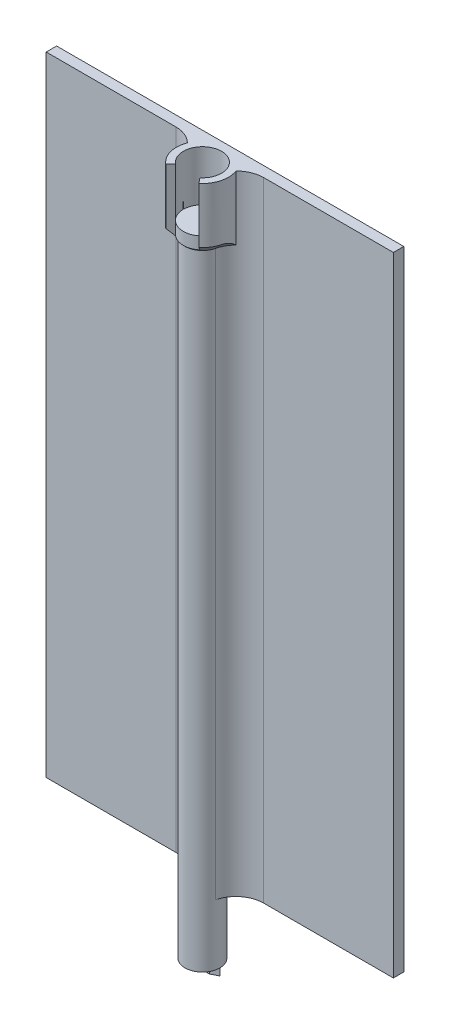
ISO-10303-21;
HEADER;
FILE_DESCRIPTION(('STEP AP214'),'2;1');
FILE_NAME('part.step','',(''),(''),'','','');
FILE_SCHEMA(('AUTOMOTIVE_DESIGN { 1 0 10303 214 1 1 1 1 }'));
ENDSEC;
DATA;
#1=APPLICATION_CONTEXT('core data for automotive mechanical design processes');
#2=APPLICATION_PROTOCOL_DEFINITION('international standard','automotive_design',2000,#1);
#3=PRODUCT_CONTEXT('',#1,'mechanical');
#4=PRODUCT('Part','Part','',(#3));
#5=PRODUCT_RELATED_PRODUCT_CATEGORY('part','',(#4));
#6=PRODUCT_DEFINITION_FORMATION('','',#4);
#7=PRODUCT_DEFINITION_CONTEXT('part definition',#1,'design');
#8=PRODUCT_DEFINITION('design','',#6,#7);
#9=PRODUCT_DEFINITION_SHAPE('','',#8);
#10=(LENGTH_UNIT() NAMED_UNIT(*) SI_UNIT(.MILLI.,.METRE.));
#11=(NAMED_UNIT(*) PLANE_ANGLE_UNIT() SI_UNIT($,.RADIAN.));
#12=(NAMED_UNIT(*) SI_UNIT($,.STERADIAN.) SOLID_ANGLE_UNIT());
#13=UNCERTAINTY_MEASURE_WITH_UNIT(LENGTH_MEASURE(1.E-05),#10,'distance_accuracy_value','');
#14=(GEOMETRIC_REPRESENTATION_CONTEXT(3) GLOBAL_UNCERTAINTY_ASSIGNED_CONTEXT((#13)) GLOBAL_UNIT_ASSIGNED_CONTEXT((#10,
#11,#12)) REPRESENTATION_CONTEXT('',''));
#15=CARTESIAN_POINT('',(0.,0.,0.));
#16=DIRECTION('',(0.,0.,1.));
#17=DIRECTION('',(1.,0.,0.));
#18=AXIS2_PLACEMENT_3D('',#15,#16,#17);
#19=CARTESIAN_POINT('',(0.,0.,3.));
#20=DIRECTION('',(0.,0.,-1.));
#21=DIRECTION('',(-1.,0.,0.));
#22=AXIS2_PLACEMENT_3D('',#19,#20,#21);
#23=PLANE('',#22);
#24=DIRECTION('',(-1.,0.,0.));
#25=VECTOR('',#24,1.);
#26=CARTESIAN_POINT('',(100.,5.,3.));
#27=LINE('',#26,#25);
#28=CARTESIAN_POINT('',(100.,5.,3.));
#29=VERTEX_POINT('',#28);
#30=CARTESIAN_POINT('',(62.6491106406735,5.,3.));
#31=VERTEX_POINT('',#30);
#32=EDGE_CURVE('E357',#29,#31,#27,.T.);
#33=ORIENTED_EDGE('',*,*,#32,.F.);
#34=DIRECTION('',(0.,1.,0.));
#35=VECTOR('',#34,1.);
#36=CARTESIAN_POINT('',(100.,0.,3.));
#37=LINE('',#36,#35);
#38=CARTESIAN_POINT('',(100.,186.,3.));
#39=VERTEX_POINT('',#38);
#40=EDGE_CURVE('E363',#29,#39,#37,.T.);
#41=ORIENTED_EDGE('',*,*,#40,.T.);
#42=DIRECTION('',(1.,0.,0.));
#43=VECTOR('',#42,1.);
#44=CARTESIAN_POINT('',(62.6491106406735,186.,3.));
#45=LINE('',#44,#43);
#46=CARTESIAN_POINT('',(62.6491106406735,186.,3.));
#47=VERTEX_POINT('',#46);
#48=EDGE_CURVE('E362',#47,#39,#45,.T.);
#49=ORIENTED_EDGE('',*,*,#48,.F.);
#50=DIRECTION('',(0.,1.,0.));
#51=VECTOR('',#50,1.);
#52=CARTESIAN_POINT('',(62.6491106406735,0.,3.));
#53=LINE('',#52,#51);
#54=EDGE_CURVE('E260',#47,#31,#53,.F.);
#55=ORIENTED_EDGE('',*,*,#54,.T.);
#56=EDGE_LOOP('',(#33,#41,#49,#55));
#57=FACE_BOUND('',#56,.T.);
#58=ADVANCED_FACE('F46',(#57),#23,.F.);
#59=CARTESIAN_POINT('',(0.,0.,3.));
#60=DIRECTION('',(1.,0.,0.));
#61=DIRECTION('',(0.,0.,-1.));
#62=AXIS2_PLACEMENT_3D('',#59,#60,#61);
#63=PLANE('',#62);
#64=DIRECTION('',(0.,0.,-1.));
#65=VECTOR('',#64,1.);
#66=CARTESIAN_POINT('',(0.,5.,3.));
#67=LINE('',#66,#65);
#68=CARTESIAN_POINT('',(0.,5.,3.));
#69=VERTEX_POINT('',#68);
#70=CARTESIAN_POINT('',(0.,5.,0.));
#71=VERTEX_POINT('',#70);
#72=EDGE_CURVE('E251',#69,#71,#67,.T.);
#73=ORIENTED_EDGE('',*,*,#72,.F.);
#74=DIRECTION('',(0.,-1.,0.));
#75=VECTOR('',#74,1.);
#76=CARTESIAN_POINT('',(0.,0.,3.));
#77=LINE('',#76,#75);
#78=CARTESIAN_POINT('',(0.,186.,3.));
#79=VERTEX_POINT('',#78);
#80=EDGE_CURVE('E249',#79,#69,#77,.T.);
#81=ORIENTED_EDGE('',*,*,#80,.F.);
#82=DIRECTION('',(0.,0.,1.));
#83=VECTOR('',#82,1.);
#84=CARTESIAN_POINT('',(0.,186.,0.));
#85=LINE('',#84,#83);
#86=CARTESIAN_POINT('',(0.,186.,0.));
#87=VERTEX_POINT('',#86);
#88=EDGE_CURVE('E382',#87,#79,#85,.T.);
#89=ORIENTED_EDGE('',*,*,#88,.F.);
#90=DIRECTION('',(0.,-1.,0.));
#91=VECTOR('',#90,1.);
#92=CARTESIAN_POINT('',(0.,0.,0.));
#93=LINE('',#92,#91);
#94=EDGE_CURVE('E471',#87,#71,#93,.T.);
#95=ORIENTED_EDGE('',*,*,#94,.T.);
#96=EDGE_LOOP('',(#73,#81,#89,#95));
#97=FACE_BOUND('',#96,.T.);
#98=ADVANCED_FACE('F319',(#97),#63,.F.);
#99=CARTESIAN_POINT('',(100.,0.,3.));
#100=DIRECTION('',(-1.,0.,0.));
#101=DIRECTION('',(0.,0.,1.));
#102=AXIS2_PLACEMENT_3D('',#99,#100,#101);
#103=PLANE('',#102);
#104=DIRECTION('',(0.,0.,1.));
#105=VECTOR('',#104,1.);
#106=CARTESIAN_POINT('',(100.,5.,0.));
#107=LINE('',#106,#105);
#108=CARTESIAN_POINT('',(100.,5.,0.));
#109=VERTEX_POINT('',#108);
#110=EDGE_CURVE('E645',#109,#29,#107,.T.);
#111=ORIENTED_EDGE('',*,*,#110,.F.);
#112=DIRECTION('',(0.,1.,0.));
#113=VECTOR('',#112,1.);
#114=CARTESIAN_POINT('',(100.,0.,0.));
#115=LINE('',#114,#113);
#116=CARTESIAN_POINT('',(100.,186.,0.));
#117=VERTEX_POINT('',#116);
#118=EDGE_CURVE('E474',#109,#117,#115,.T.);
#119=ORIENTED_EDGE('',*,*,#118,.T.);
#120=DIRECTION('',(0.,0.,-1.));
#121=VECTOR('',#120,1.);
#122=CARTESIAN_POINT('',(100.,186.,3.));
#123=LINE('',#122,#121);
#124=EDGE_CURVE('E368',#39,#117,#123,.T.);
#125=ORIENTED_EDGE('',*,*,#124,.F.);
#126=ORIENTED_EDGE('',*,*,#40,.F.);
#127=EDGE_LOOP('',(#111,#119,#125,#126));
#128=FACE_BOUND('',#127,.T.);
#129=ADVANCED_FACE('F326',(#128),#103,.F.);
#130=DIRECTION('',(-1.,0.,0.));
#131=VECTOR('',#130,1.);
#132=CARTESIAN_POINT('',(37.3508893593265,5.,3.));
#133=LINE('',#132,#131);
#134=CARTESIAN_POINT('',(37.3508893593265,5.,3.));
#135=VERTEX_POINT('',#134);
#136=EDGE_CURVE('E235',#135,#69,#133,.T.);
#137=ORIENTED_EDGE('',*,*,#136,.F.);
#138=DIRECTION('',(0.,1.,0.));
#139=VECTOR('',#138,1.);
#140=CARTESIAN_POINT('',(37.3508893593265,0.,3.));
#141=LINE('',#140,#139);
#142=CARTESIAN_POINT('',(37.3508893593265,186.,3.));
#143=VERTEX_POINT('',#142);
#144=EDGE_CURVE('E247',#135,#143,#141,.T.);
#145=ORIENTED_EDGE('',*,*,#144,.T.);
#146=DIRECTION('',(1.,0.,0.));
#147=VECTOR('',#146,1.);
#148=CARTESIAN_POINT('',(0.,186.,3.));
#149=LINE('',#148,#147);
#150=EDGE_CURVE('E386',#79,#143,#149,.T.);
#151=ORIENTED_EDGE('',*,*,#150,.F.);
#152=ORIENTED_EDGE('',*,*,#80,.T.);
#153=EDGE_LOOP('',(#137,#145,#151,#152));
#154=FACE_BOUND('',#153,.T.);
#155=ADVANCED_FACE('F245',(#154),#23,.F.);
#156=CARTESIAN_POINT('',(0.,0.,0.));
#157=DIRECTION('',(0.,0.,-1.));
#158=DIRECTION('',(-1.,0.,0.));
#159=AXIS2_PLACEMENT_3D('',#156,#157,#158);
#160=PLANE('',#159);
#161=ORIENTED_EDGE('',*,*,#118,.F.);
#162=DIRECTION('',(1.,0.,0.));
#163=VECTOR('',#162,1.);
#164=CARTESIAN_POINT('',(0.,5.,0.));
#165=LINE('',#164,#163);
#166=EDGE_CURVE('E648',#71,#109,#165,.T.);
#167=ORIENTED_EDGE('',*,*,#166,.F.);
#168=ORIENTED_EDGE('',*,*,#94,.F.);
#169=DIRECTION('',(-1.,0.,0.));
#170=VECTOR('',#169,1.);
#171=CARTESIAN_POINT('',(100.,186.,0.));
#172=LINE('',#171,#170);
#173=EDGE_CURVE('E373',#117,#87,#172,.T.);
#174=ORIENTED_EDGE('',*,*,#173,.F.);
#175=EDGE_LOOP('',(#161,#167,#168,#174));
#176=FACE_BOUND('',#175,.T.);
#177=ADVANCED_FACE('F333',(#176),#160,.T.);
#178=CARTESIAN_POINT('',(62.6491106406735,-14.142135623731,11.));
#179=DIRECTION('',(0.,1.,0.));
#180=DIRECTION('',(0.,0.,1.));
#181=AXIS2_PLACEMENT_3D('',#178,#179,#180);
#182=CYLINDRICAL_SURFACE('',#181,8.);
#183=CARTESIAN_POINT('',(62.6491106406735,5.,11.));
#184=DIRECTION('',(0.,1.,0.));
#185=DIRECTION('',(0.,0.,-1.));
#186=AXIS2_PLACEMENT_3D('',#183,#184,#185);
#187=CIRCLE('',#186,8.);
#188=CARTESIAN_POINT('',(54.8650425541052,5.,9.15384615384615));
#189=VERTEX_POINT('',#188);
#190=EDGE_CURVE('E353',#31,#189,#187,.T.);
#191=ORIENTED_EDGE('',*,*,#190,.F.);
#192=ORIENTED_EDGE('',*,*,#54,.F.);
#193=CARTESIAN_POINT('',(62.6491106406735,186.,11.));
#194=DIRECTION('',(0.,-1.,0.));
#195=DIRECTION('',(0.,0.,1.));
#196=AXIS2_PLACEMENT_3D('',#193,#194,#195);
#197=CIRCLE('',#196,8.);
#198=CARTESIAN_POINT('',(57.0077615383015,186.,5.32768298618929));
#199=VERTEX_POINT('',#198);
#200=EDGE_CURVE('E369',#199,#47,#197,.T.);
#201=ORIENTED_EDGE('',*,*,#200,.F.);
#202=DIRECTION('',(0.,-1.,0.));
#203=VECTOR('',#202,1.);
#204=CARTESIAN_POINT('',(57.0077615383015,186.,5.32768298618929));
#205=LINE('',#204,#203);
#206=CARTESIAN_POINT('',(57.0077615383015,167.5,5.32768298618929));
#207=VERTEX_POINT('',#206);
#208=EDGE_CURVE('E389',#199,#207,#205,.T.);
#209=ORIENTED_EDGE('',*,*,#208,.T.);
#210=CARTESIAN_POINT('',(62.6491106406735,167.5,11.));
#211=DIRECTION('',(0.,1.,0.));
#212=DIRECTION('',(0.,0.,1.));
#213=AXIS2_PLACEMENT_3D('',#210,#211,#212);
#214=CIRCLE('',#213,8.);
#215=CARTESIAN_POINT('',(54.8650425541052,167.5,9.15384615384615));
#216=VERTEX_POINT('',#215);
#217=EDGE_CURVE('E265',#207,#216,#214,.T.);
#218=ORIENTED_EDGE('',*,*,#217,.T.);
#219=DIRECTION('',(0.,1.,0.));
#220=VECTOR('',#219,1.);
#221=CARTESIAN_POINT('',(54.8650425541052,-14.142135623731,9.15384615384615));
#222=LINE('',#221,#220);
#223=EDGE_CURVE('E268',#189,#216,#222,.T.);
#224=ORIENTED_EDGE('',*,*,#223,.F.);
#225=EDGE_LOOP('',(#191,#192,#201,#209,#218,#224));
#226=FACE_BOUND('',#225,.T.);
#227=ADVANCED_FACE('F338',(#226),#182,.F.);
#228=CARTESIAN_POINT('',(37.3508893593265,-14.142135623731,11.));
#229=DIRECTION('',(0.,1.,0.));
#230=DIRECTION('',(0.,0.,1.));
#231=AXIS2_PLACEMENT_3D('',#228,#229,#230);
#232=CYLINDRICAL_SURFACE('',#231,8.);
#233=CARTESIAN_POINT('',(37.3508893593265,5.,11.));
#234=DIRECTION('',(0.,1.,0.));
#235=DIRECTION('',(0.,0.,-1.));
#236=AXIS2_PLACEMENT_3D('',#233,#234,#235);
#237=CIRCLE('',#236,8.);
#238=CARTESIAN_POINT('',(45.1349574458948,5.,9.15384615384616));
#239=VERTEX_POINT('',#238);
#240=EDGE_CURVE('E232',#239,#135,#237,.T.);
#241=ORIENTED_EDGE('',*,*,#240,.F.);
#242=DIRECTION('',(0.,1.,0.));
#243=VECTOR('',#242,1.);
#244=CARTESIAN_POINT('',(45.1349574458948,-14.142135623731,9.15384615384616));
#245=LINE('',#244,#243);
#246=CARTESIAN_POINT('',(45.1349574458948,167.5,9.15384615384616));
#247=VERTEX_POINT('',#246);
#248=EDGE_CURVE('E477',#247,#239,#245,.F.);
#249=ORIENTED_EDGE('',*,*,#248,.F.);
#250=CARTESIAN_POINT('',(37.3508893593265,167.5,11.));
#251=DIRECTION('',(0.,1.,0.));
#252=DIRECTION('',(0.,0.,1.));
#253=AXIS2_PLACEMENT_3D('',#250,#251,#252);
#254=CIRCLE('',#253,8.);
#255=CARTESIAN_POINT('',(42.9922384616985,167.5,5.32768298618929));
#256=VERTEX_POINT('',#255);
#257=EDGE_CURVE('E259',#247,#256,#254,.T.);
#258=ORIENTED_EDGE('',*,*,#257,.T.);
#259=DIRECTION('',(0.,-1.,0.));
#260=VECTOR('',#259,1.);
#261=CARTESIAN_POINT('',(42.9922384616985,186.,5.32768298618929));
#262=LINE('',#261,#260);
#263=CARTESIAN_POINT('',(42.9922384616985,186.,5.32768298618929));
#264=VERTEX_POINT('',#263);
#265=EDGE_CURVE('E396',#264,#256,#262,.T.);
#266=ORIENTED_EDGE('',*,*,#265,.F.);
#267=CARTESIAN_POINT('',(37.3508893593265,186.,11.));
#268=DIRECTION('',(0.,-1.,0.));
#269=DIRECTION('',(0.,0.,1.));
#270=AXIS2_PLACEMENT_3D('',#267,#268,#269);
#271=CIRCLE('',#270,8.);
#272=EDGE_CURVE('E257',#143,#264,#271,.T.);
#273=ORIENTED_EDGE('',*,*,#272,.F.);
#274=ORIENTED_EDGE('',*,*,#144,.F.);
#275=EDGE_LOOP('',(#241,#249,#258,#266,#273,#274));
#276=FACE_BOUND('',#275,.T.);
#277=ADVANCED_FACE('F254',(#276),#232,.F.);
#278=CARTESIAN_POINT('',(50.,-14.501,8.));
#279=DIRECTION('',(0.,1.,0.));
#280=DIRECTION('',(0.,0.,1.));
#281=AXIS2_PLACEMENT_3D('',#278,#279,#280);
#282=CYLINDRICAL_SURFACE('',#281,5.5);
#283=CARTESIAN_POINT('',(50.,171.5,8.));
#284=DIRECTION('',(0.,1.,0.));
#285=DIRECTION('',(0.,0.,1.));
#286=AXIS2_PLACEMENT_3D('',#283,#284,#285);
#287=CIRCLE('',#286,5.5);
#288=CARTESIAN_POINT('',(46.5,171.5,12.2426406871193));
#289=VERTEX_POINT('',#288);
#290=CARTESIAN_POINT('',(53.5,171.5,12.2426406871193));
#291=VERTEX_POINT('',#290);
#292=EDGE_CURVE('E633',#289,#291,#287,.T.);
#293=ORIENTED_EDGE('',*,*,#292,.F.);
#294=DIRECTION('',(0.,1.,0.));
#295=VECTOR('',#294,1.);
#296=CARTESIAN_POINT('',(46.5,-14.501,12.2426406871193));
#297=LINE('',#296,#295);
#298=CARTESIAN_POINT('',(46.5,168.,12.2426406871193));
#299=VERTEX_POINT('',#298);
#300=EDGE_CURVE('E570',#299,#289,#297,.T.);
#301=ORIENTED_EDGE('',*,*,#300,.F.);
#302=CARTESIAN_POINT('',(50.,168.,8.));
#303=DIRECTION('',(0.,1.,0.));
#304=DIRECTION('',(0.,0.,1.));
#305=AXIS2_PLACEMENT_3D('',#302,#303,#304);
#306=CIRCLE('',#305,5.5);
#307=CARTESIAN_POINT('',(53.5,168.,12.2426406871193));
#308=VERTEX_POINT('',#307);
#309=EDGE_CURVE('E58',#299,#308,#306,.T.);
#310=ORIENTED_EDGE('',*,*,#309,.T.);
#311=DIRECTION('',(0.,1.,0.));
#312=VECTOR('',#311,1.);
#313=CARTESIAN_POINT('',(53.5,-14.501,12.2426406871193));
#314=LINE('',#313,#312);
#315=EDGE_CURVE('E574',#308,#291,#314,.T.);
#316=ORIENTED_EDGE('',*,*,#315,.T.);
#317=EDGE_LOOP('',(#293,#301,#310,#316));
#318=FACE_BOUND('',#317,.T.);
#319=ADVANCED_FACE('F350',(#318),#282,.T.);
#320=CARTESIAN_POINT('',(50.,186.,8.));
#321=DIRECTION('',(0.,-1.,0.));
#322=DIRECTION('',(0.,0.,-1.));
#323=AXIS2_PLACEMENT_3D('',#320,#321,#322);
#324=CYLINDRICAL_SURFACE('',#323,7.5);
#325=ORIENTED_EDGE('',*,*,#265,.T.);
#326=CARTESIAN_POINT('',(42.9922384616985,167.5,5.32768298618928));
#327=CARTESIAN_POINT('',(42.9617722844058,167.578131879212,5.40758353514014));
#328=CARTESIAN_POINT('',(42.9325252242345,167.655820019289,5.4883758120596));
#329=CARTESIAN_POINT('',(42.876541438332,167.810134983572,5.65184939678492));
#330=CARTESIAN_POINT('',(42.8498051513553,167.886761620294,5.73453103162658));
#331=CARTESIAN_POINT('',(42.7732755527246,168.115376278993,5.98621812586946));
#332=CARTESIAN_POINT('',(42.7274149000267,168.265449562082,6.15820638188107));
#333=CARTESIAN_POINT('',(42.6454737688333,168.56395151696,6.51799036748483));
#334=CARTESIAN_POINT('',(42.6098532272861,168.712078991326,6.70614248560052));
#335=CARTESIAN_POINT('',(42.5524527679631,168.996073760214,7.09321290457301));
#336=CARTESIAN_POINT('',(42.5306462889955,169.131964149318,7.29210974138871));
#337=CARTESIAN_POINT('',(42.5105973632104,169.3160741218,7.59064334358421));
#338=CARTESIAN_POINT('',(42.5059895831001,169.371712984647,7.68530249605931));
#339=CARTESIAN_POINT('',(42.5003861555197,169.478243627192,7.87739724677104));
#340=CARTESIAN_POINT('',(42.4993907744316,169.52913505654,7.97483304922674));
#341=CARTESIAN_POINT('',(42.5013201657649,169.624482344453,8.17121296754097));
#342=CARTESIAN_POINT('',(42.5041937890188,169.669013730931,8.27012063901423));
#343=CARTESIAN_POINT('',(42.5141044408867,169.751220094265,8.47056288045698));
#344=CARTESIAN_POINT('',(42.5211407875799,169.788896192806,8.57209701756469));
#345=CARTESIAN_POINT('',(42.5381155359772,169.850365614392,8.7600012849123));
#346=CARTESIAN_POINT('',(42.5473578163175,169.875430052344,8.84601707364397));
#347=CARTESIAN_POINT('',(42.5690664818109,169.91917111767,9.01923742082545));
#348=CARTESIAN_POINT('',(42.5815315065788,169.937850432626,9.10644146301178));
#349=CARTESIAN_POINT('',(42.6100284827085,169.968429637059,9.28314139527606));
#350=CARTESIAN_POINT('',(42.6261209878257,169.980200517391,9.3726501777183));
#351=CARTESIAN_POINT('',(42.6617244192038,169.996020162218,9.55181686409721));
#352=CARTESIAN_POINT('',(42.6812408575192,170.00005634808,9.64147477401341));
#353=CARTESIAN_POINT('',(42.7024361688422,170.,9.73076923076925));
#354=B_SPLINE_CURVE_WITH_KNOTS('',3,(#326,#327,#328,#329,#330,#331,#332,#333,#334,#335,#336,
#337,#338,#339,#340,#341,#342,#343,#344,#345,#346,#347,#348,#349,#350,#351,#352,#353),
.UNSPECIFIED.,.F.,.F.,(4,2,2,2,2,2,2,2,2,2,2,2,2,4),(0.,0.347470583809525,0.695001775105091,
1.39293859532156,2.11855144427092,2.84276484157499,3.17230030645231,3.50186007111648,
3.82710548252779,4.15229762827214,4.42224264120378,4.69207389043962,4.96679567223757,
5.24196384546593),.UNSPECIFIED.);
#355=CARTESIAN_POINT('',(42.7024361688422,170.,9.73076923076923));
#356=VERTEX_POINT('',#355);
#357=EDGE_CURVE('E278',#256,#356,#354,.T.);
#358=ORIENTED_EDGE('',*,*,#357,.T.);
#359=CARTESIAN_POINT('',(50.,170.,8.));
#360=DIRECTION('',(0.,1.,0.));
#361=DIRECTION('',(0.,0.,1.));
#362=AXIS2_PLACEMENT_3D('',#359,#360,#361);
#363=CIRCLE('',#362,7.5);
#364=CARTESIAN_POINT('',(45.2272727272727,170.,13.785419118799));
#365=VERTEX_POINT('',#364);
#366=EDGE_CURVE('E390',#356,#365,#363,.T.);
#367=ORIENTED_EDGE('',*,*,#366,.T.);
#368=DIRECTION('',(0.,1.,0.));
#369=VECTOR('',#368,1.);
#370=CARTESIAN_POINT('',(45.2272727272727,-14.501,13.785419118799));
#371=LINE('',#370,#369);
#372=CARTESIAN_POINT('',(45.2272727272727,186.,13.785419118799));
#373=VERTEX_POINT('',#372);
#374=EDGE_CURVE('E565',#365,#373,#371,.T.);
#375=ORIENTED_EDGE('',*,*,#374,.T.);
#376=CARTESIAN_POINT('',(50.,186.,8.));
#377=DIRECTION('',(0.,1.,0.));
#378=DIRECTION('',(0.,0.,1.));
#379=AXIS2_PLACEMENT_3D('',#376,#377,#378);
#380=CIRCLE('',#379,7.5);
#381=EDGE_CURVE('E375',#264,#373,#380,.T.);
#382=ORIENTED_EDGE('',*,*,#381,.F.);
#383=EDGE_LOOP('',(#325,#358,#367,#375,#382));
#384=FACE_BOUND('',#383,.T.);
#385=ADVANCED_FACE('F657',(#384),#324,.T.);
#386=CARTESIAN_POINT('',(50.,-12.5,8.));
#387=DIRECTION('',(0.,-1.,0.));
#388=DIRECTION('',(0.,0.,-1.));
#389=AXIS2_PLACEMENT_3D('',#386,#387,#388);
#390=PLANE('',#389);
#391=DIRECTION('',(-0.894427190999917,0.,0.447213595499956));
#392=VECTOR('',#391,1.);
#393=CARTESIAN_POINT('',(53.,-12.5,9.));
#394=LINE('',#393,#392);
#395=CARTESIAN_POINT('',(55.,-12.5,8.));
#396=VERTEX_POINT('',#395);
#397=CARTESIAN_POINT('',(53.,-12.5,9.));
#398=VERTEX_POINT('',#397);
#399=EDGE_CURVE('E399',#396,#398,#394,.T.);
#400=ORIENTED_EDGE('',*,*,#399,.F.);
#401=CARTESIAN_POINT('',(50.,-12.5,8.));
#402=DIRECTION('',(0.,-1.,0.));
#403=DIRECTION('',(0.,0.,-1.));
#404=AXIS2_PLACEMENT_3D('',#401,#402,#403);
#405=CIRCLE('',#404,5.);
#406=CARTESIAN_POINT('',(45.,-12.5,8.));
#407=VERTEX_POINT('',#406);
#408=EDGE_CURVE('E467',#396,#407,#405,.T.);
#409=ORIENTED_EDGE('',*,*,#408,.T.);
#410=DIRECTION('',(-0.894427190999916,0.,-0.447213595499957));
#411=VECTOR('',#410,1.);
#412=CARTESIAN_POINT('',(47.,-12.5,9.));
#413=LINE('',#412,#411);
#414=CARTESIAN_POINT('',(47.,-12.5,9.));
#415=VERTEX_POINT('',#414);
#416=EDGE_CURVE('E428',#415,#407,#413,.T.);
#417=ORIENTED_EDGE('',*,*,#416,.F.);
#418=DIRECTION('',(-1.,0.,0.));
#419=VECTOR('',#418,1.);
#420=CARTESIAN_POINT('',(47.,-12.5,9.));
#421=LINE('',#420,#419);
#422=EDGE_CURVE('E424',#398,#415,#421,.T.);
#423=ORIENTED_EDGE('',*,*,#422,.F.);
#424=EDGE_LOOP('',(#400,#409,#417,#423));
#425=FACE_BOUND('',#424,.T.);
#426=ADVANCED_FACE('F700',(#425),#390,.T.);
#427=CARTESIAN_POINT('',(50.,-14.142135623731,8.));
#428=DIRECTION('',(0.,1.,0.));
#429=DIRECTION('',(0.,0.,1.));
#430=AXIS2_PLACEMENT_3D('',#427,#428,#429);
#431=CYLINDRICAL_SURFACE('',#430,5.);
#432=CARTESIAN_POINT('',(50.,5.,8.));
#433=DIRECTION('',(0.,1.,0.));
#434=DIRECTION('',(0.,0.,-1.));
#435=AXIS2_PLACEMENT_3D('',#432,#433,#434);
#436=CIRCLE('',#435,5.);
#437=EDGE_CURVE('E66',#189,#239,#436,.T.);
#438=ORIENTED_EDGE('',*,*,#437,.F.);
#439=ORIENTED_EDGE('',*,*,#223,.T.);
#440=CARTESIAN_POINT('',(50.,167.5,8.));
#441=DIRECTION('',(0.,1.,0.));
#442=DIRECTION('',(0.,0.,1.));
#443=AXIS2_PLACEMENT_3D('',#440,#441,#442);
#444=CIRCLE('',#443,5.);
#445=EDGE_CURVE('E275',#216,#247,#444,.F.);
#446=ORIENTED_EDGE('',*,*,#445,.T.);
#447=ORIENTED_EDGE('',*,*,#248,.T.);
#448=EDGE_LOOP('',(#438,#439,#446,#447));
#449=FACE_BOUND('',#448,.T.);
#450=ORIENTED_EDGE('',*,*,#408,.F.);
#451=EDGE_CURVE('E466',#407,#396,#405,.T.);
#452=ORIENTED_EDGE('',*,*,#451,.F.);
#453=EDGE_LOOP('',(#450,#452));
#454=FACE_BOUND('',#453,.T.);
#455=ADVANCED_FACE('F486',(#449,#454),#431,.T.);
#456=DIRECTION('',(0.894427190999916,0.,0.447213595499957));
#457=VECTOR('',#456,1.);
#458=CARTESIAN_POINT('',(55.,-12.5,8.));
#459=LINE('',#458,#457);
#460=CARTESIAN_POINT('',(53.,-12.5,7.));
#461=VERTEX_POINT('',#460);
#462=EDGE_CURVE('E405',#461,#396,#459,.T.);
#463=ORIENTED_EDGE('',*,*,#462,.F.);
#464=DIRECTION('',(1.,0.,0.));
#465=VECTOR('',#464,1.);
#466=CARTESIAN_POINT('',(47.,-12.5,7.));
#467=LINE('',#466,#465);
#468=CARTESIAN_POINT('',(47.,-12.5,7.));
#469=VERTEX_POINT('',#468);
#470=EDGE_CURVE('E436',#469,#461,#467,.T.);
#471=ORIENTED_EDGE('',*,*,#470,.F.);
#472=DIRECTION('',(0.894427190999916,0.,-0.447213595499958));
#473=VECTOR('',#472,1.);
#474=CARTESIAN_POINT('',(45.,-12.5,8.));
#475=LINE('',#474,#473);
#476=EDGE_CURVE('E432',#407,#469,#475,.T.);
#477=ORIENTED_EDGE('',*,*,#476,.F.);
#478=ORIENTED_EDGE('',*,*,#451,.T.);
#479=EDGE_LOOP('',(#463,#471,#477,#478));
#480=FACE_BOUND('',#479,.T.);
#481=ADVANCED_FACE('F706',(#480),#390,.T.);
#482=CARTESIAN_POINT('',(53.,-14.5,9.));
#483=DIRECTION('',(-0.447213595499956,0.,-0.894427190999917));
#484=DIRECTION('',(-0.894427190999917,0.,0.447213595499956));
#485=AXIS2_PLACEMENT_3D('',#482,#483,#484);
#486=PLANE('',#485);
#487=ORIENTED_EDGE('',*,*,#399,.T.);
#488=DIRECTION('',(0.,1.,0.));
#489=VECTOR('',#488,1.);
#490=CARTESIAN_POINT('',(53.,-14.5,9.));
#491=LINE('',#490,#489);
#492=CARTESIAN_POINT('',(53.,-14.5,9.));
#493=VERTEX_POINT('',#492);
#494=EDGE_CURVE('E462',#493,#398,#491,.T.);
#495=ORIENTED_EDGE('',*,*,#494,.F.);
#496=DIRECTION('',(-0.894427190999917,0.,0.447213595499956));
#497=VECTOR('',#496,1.);
#498=CARTESIAN_POINT('',(53.,-14.5,9.));
#499=LINE('',#498,#497);
#500=CARTESIAN_POINT('',(55.,-14.5,8.));
#501=VERTEX_POINT('',#500);
#502=EDGE_CURVE('E400',#501,#493,#499,.T.);
#503=ORIENTED_EDGE('',*,*,#502,.F.);
#504=DIRECTION('',(0.,1.,0.));
#505=VECTOR('',#504,1.);
#506=CARTESIAN_POINT('',(55.,-14.5,8.));
#507=LINE('',#506,#505);
#508=EDGE_CURVE('E420',#501,#396,#507,.T.);
#509=ORIENTED_EDGE('',*,*,#508,.T.);
#510=EDGE_LOOP('',(#487,#495,#503,#509));
#511=FACE_BOUND('',#510,.T.);
#512=ADVANCED_FACE('F877',(#511),#486,.F.);
#513=CARTESIAN_POINT('',(47.,-14.5,9.));
#514=DIRECTION('',(0.,0.,-1.));
#515=DIRECTION('',(-1.,0.,0.));
#516=AXIS2_PLACEMENT_3D('',#513,#514,#515);
#517=PLANE('',#516);
#518=ORIENTED_EDGE('',*,*,#422,.T.);
#519=DIRECTION('',(0.,1.,0.));
#520=VECTOR('',#519,1.);
#521=CARTESIAN_POINT('',(47.,-14.5,9.));
#522=LINE('',#521,#520);
#523=CARTESIAN_POINT('',(47.,-14.5,9.));
#524=VERTEX_POINT('',#523);
#525=EDGE_CURVE('E458',#524,#415,#522,.T.);
#526=ORIENTED_EDGE('',*,*,#525,.F.);
#527=DIRECTION('',(-1.,0.,0.));
#528=VECTOR('',#527,1.);
#529=CARTESIAN_POINT('',(47.,-14.5,9.));
#530=LINE('',#529,#528);
#531=EDGE_CURVE('E404',#493,#524,#530,.T.);
#532=ORIENTED_EDGE('',*,*,#531,.F.);
#533=ORIENTED_EDGE('',*,*,#494,.T.);
#534=EDGE_LOOP('',(#518,#526,#532,#533));
#535=FACE_BOUND('',#534,.T.);
#536=ADVANCED_FACE('F867',(#535),#517,.F.);
#537=CARTESIAN_POINT('',(47.,-14.5,9.));
#538=DIRECTION('',(0.447213595499957,0.,-0.894427190999916));
#539=DIRECTION('',(-0.894427190999916,0.,-0.447213595499957));
#540=AXIS2_PLACEMENT_3D('',#537,#538,#539);
#541=PLANE('',#540);
#542=ORIENTED_EDGE('',*,*,#416,.T.);
#543=DIRECTION('',(0.,1.,0.));
#544=VECTOR('',#543,1.);
#545=CARTESIAN_POINT('',(45.,-14.5,8.));
#546=LINE('',#545,#544);
#547=CARTESIAN_POINT('',(45.,-14.5,8.));
#548=VERTEX_POINT('',#547);
#549=EDGE_CURVE('E454',#548,#407,#546,.T.);
#550=ORIENTED_EDGE('',*,*,#549,.F.);
#551=DIRECTION('',(-0.894427190999916,0.,-0.447213595499957));
#552=VECTOR('',#551,1.);
#553=CARTESIAN_POINT('',(47.,-14.5,9.));
#554=LINE('',#553,#552);
#555=EDGE_CURVE('E408',#524,#548,#554,.T.);
#556=ORIENTED_EDGE('',*,*,#555,.F.);
#557=ORIENTED_EDGE('',*,*,#525,.T.);
#558=EDGE_LOOP('',(#542,#550,#556,#557));
#559=FACE_BOUND('',#558,.T.);
#560=ADVANCED_FACE('F857',(#559),#541,.F.);
#561=CARTESIAN_POINT('',(45.,-14.5,8.));
#562=DIRECTION('',(0.447213595499958,0.,0.894427190999916));
#563=DIRECTION('',(0.894427190999916,0.,-0.447213595499958));
#564=AXIS2_PLACEMENT_3D('',#561,#562,#563);
#565=PLANE('',#564);
#566=ORIENTED_EDGE('',*,*,#476,.T.);
#567=DIRECTION('',(0.,1.,0.));
#568=VECTOR('',#567,1.);
#569=CARTESIAN_POINT('',(47.,-14.5,7.));
#570=LINE('',#569,#568);
#571=CARTESIAN_POINT('',(47.,-14.5,7.));
#572=VERTEX_POINT('',#571);
#573=EDGE_CURVE('E450',#572,#469,#570,.T.);
#574=ORIENTED_EDGE('',*,*,#573,.F.);
#575=DIRECTION('',(0.894427190999916,0.,-0.447213595499958));
#576=VECTOR('',#575,1.);
#577=CARTESIAN_POINT('',(45.,-14.5,8.));
#578=LINE('',#577,#576);
#579=EDGE_CURVE('E411',#548,#572,#578,.T.);
#580=ORIENTED_EDGE('',*,*,#579,.F.);
#581=ORIENTED_EDGE('',*,*,#549,.T.);
#582=EDGE_LOOP('',(#566,#574,#580,#581));
#583=FACE_BOUND('',#582,.T.);
#584=ADVANCED_FACE('F847',(#583),#565,.F.);
#585=CARTESIAN_POINT('',(47.,-14.5,7.));
#586=DIRECTION('',(0.,0.,1.));
#587=DIRECTION('',(1.,0.,0.));
#588=AXIS2_PLACEMENT_3D('',#585,#586,#587);
#589=PLANE('',#588);
#590=ORIENTED_EDGE('',*,*,#470,.T.);
#591=DIRECTION('',(0.,1.,0.));
#592=VECTOR('',#591,1.);
#593=CARTESIAN_POINT('',(53.,-14.5,7.));
#594=LINE('',#593,#592);
#595=CARTESIAN_POINT('',(53.,-14.5,7.));
#596=VERTEX_POINT('',#595);
#597=EDGE_CURVE('E446',#596,#461,#594,.T.);
#598=ORIENTED_EDGE('',*,*,#597,.F.);
#599=DIRECTION('',(1.,0.,0.));
#600=VECTOR('',#599,1.);
#601=CARTESIAN_POINT('',(47.,-14.5,7.));
#602=LINE('',#601,#600);
#603=EDGE_CURVE('E414',#572,#596,#602,.T.);
#604=ORIENTED_EDGE('',*,*,#603,.F.);
#605=ORIENTED_EDGE('',*,*,#573,.T.);
#606=EDGE_LOOP('',(#590,#598,#604,#605));
#607=FACE_BOUND('',#606,.T.);
#608=ADVANCED_FACE('F837',(#607),#589,.F.);
#609=CARTESIAN_POINT('',(55.,-14.5,8.));
#610=DIRECTION('',(-0.447213595499957,0.,0.894427190999917));
#611=DIRECTION('',(0.894427190999917,0.,0.447213595499957));
#612=AXIS2_PLACEMENT_3D('',#609,#610,#611);
#613=PLANE('',#612);
#614=ORIENTED_EDGE('',*,*,#462,.T.);
#615=ORIENTED_EDGE('',*,*,#508,.F.);
#616=DIRECTION('',(0.894427190999916,0.,0.447213595499957));
#617=VECTOR('',#616,1.);
#618=CARTESIAN_POINT('',(55.,-14.5,8.));
#619=LINE('',#618,#617);
#620=EDGE_CURVE('E417',#596,#501,#619,.T.);
#621=ORIENTED_EDGE('',*,*,#620,.F.);
#622=ORIENTED_EDGE('',*,*,#597,.T.);
#623=EDGE_LOOP('',(#614,#615,#621,#622));
#624=FACE_BOUND('',#623,.T.);
#625=ADVANCED_FACE('F698',(#624),#613,.F.);
#626=CARTESIAN_POINT('',(0.,-14.5,0.));
#627=DIRECTION('',(0.,1.,0.));
#628=DIRECTION('',(0.,0.,1.));
#629=AXIS2_PLACEMENT_3D('',#626,#627,#628);
#630=PLANE('',#629);
#631=ORIENTED_EDGE('',*,*,#502,.T.);
#632=ORIENTED_EDGE('',*,*,#531,.T.);
#633=ORIENTED_EDGE('',*,*,#555,.T.);
#634=ORIENTED_EDGE('',*,*,#579,.T.);
#635=ORIENTED_EDGE('',*,*,#603,.T.);
#636=ORIENTED_EDGE('',*,*,#620,.T.);
#637=EDGE_LOOP('',(#631,#632,#633,#634,#635,#636));
#638=FACE_BOUND('',#637,.T.);
#639=ADVANCED_FACE('F695',(#638),#630,.F.);
#640=CARTESIAN_POINT('',(54.7727272727273,186.,13.785419118799));
#641=VERTEX_POINT('',#640);
#642=EDGE_CURVE('E548',#641,#199,#380,.T.);
#643=ORIENTED_EDGE('',*,*,#642,.F.);
#644=DIRECTION('',(0.,1.,0.));
#645=VECTOR('',#644,1.);
#646=CARTESIAN_POINT('',(54.7727272727273,-14.501,13.785419118799));
#647=LINE('',#646,#645);
#648=CARTESIAN_POINT('',(54.7727272727273,170.,13.785419118799));
#649=VERTEX_POINT('',#648);
#650=EDGE_CURVE('E523',#649,#641,#647,.T.);
#651=ORIENTED_EDGE('',*,*,#650,.F.);
#652=CARTESIAN_POINT('',(57.2975638311578,170.,9.73076923076923));
#653=VERTEX_POINT('',#652);
#654=EDGE_CURVE('E393',#649,#653,#363,.T.);
#655=ORIENTED_EDGE('',*,*,#654,.T.);
#656=CARTESIAN_POINT('',(57.2975638311578,170.,9.73076923076924));
#657=CARTESIAN_POINT('',(57.3201962867838,170.000071874496,9.63543521017514));
#658=CARTESIAN_POINT('',(57.3409088810974,169.995463694336,9.53969381961624));
#659=CARTESIAN_POINT('',(57.3784158059169,169.977452071494,9.3484684263812));
#660=CARTESIAN_POINT('',(57.395218076195,169.964066665536,9.25298429821501));
#661=CARTESIAN_POINT('',(57.4246257441988,169.929406680825,9.0648232000829));
#662=CARTESIAN_POINT('',(57.4373074311937,169.908293027109,8.97212802124503));
#663=CARTESIAN_POINT('',(57.4590454600218,169.858991928222,8.78817608474681));
#664=CARTESIAN_POINT('',(57.4680997748769,169.830800542283,8.6969201586242));
#665=CARTESIAN_POINT('',(57.4855173993743,169.756488099766,8.48227324621945));
#666=CARTESIAN_POINT('',(57.4923386923831,169.707612005695,8.35971127064579));
#667=CARTESIAN_POINT('',(57.500034258294,169.600515456726,8.11857036971124));
#668=CARTESIAN_POINT('',(57.5009059355653,169.542290934738,7.99999320524355));
#669=CARTESIAN_POINT('',(57.4972544852059,169.417548246181,7.76508729219905));
#670=CARTESIAN_POINT('',(57.4926489266666,169.350917193574,7.64882036250319));
#671=CARTESIAN_POINT('',(57.478432445095,169.211707940315,7.42020028090426));
#672=CARTESIAN_POINT('',(57.468819527765,169.139127379845,7.30784870741854));
#673=CARTESIAN_POINT('',(57.4382099056176,168.946402927437,7.02345296437352));
#674=CARTESIAN_POINT('',(57.4138464995897,168.822834630541,6.85409143515947));
#675=CARTESIAN_POINT('',(57.3550854333523,168.567712790986,6.52319059364176));
#676=CARTESIAN_POINT('',(57.3206787368805,168.43615214214,6.361658478991));
#677=CARTESIAN_POINT('',(57.2441190421687,168.172277772443,6.05132313459903));
#678=CARTESIAN_POINT('',(57.202289635217,168.040161798172,5.90227099632111));
#679=CARTESIAN_POINT('',(57.1336456440027,167.839326990074,5.68333723388971));
#680=CARTESIAN_POINT('',(57.1098091365596,167.772010713311,5.61120675766804));
#681=CARTESIAN_POINT('',(57.0602142920065,167.636576737665,5.4683830931481));
#682=CARTESIAN_POINT('',(57.0344560968063,167.568459098272,5.39768979920858));
#683=CARTESIAN_POINT('',(57.0077615383015,167.5,5.32768298618929));
#684=B_SPLINE_CURVE_WITH_KNOTS('',3,(#656,#657,#658,#659,#660,#661,#662,#663,#664,#665,#666,
#667,#668,#669,#670,#671,#672,#673,#674,#675,#676,#677,#678,#679,#680,#681,#682,#683),
.UNSPECIFIED.,.F.,.F.,(4,2,2,2,2,2,2,2,2,2,2,2,2,4),(0.,0.293749116612569,0.586896478496116,
0.874257915728504,1.16177970750039,1.55749154720012,1.95337601253961,2.35529460625013,
2.75737339596469,3.38983295772117,4.02286332637957,4.63309634552524,4.93757358493732,
5.24202836198308),.UNSPECIFIED.);
#685=EDGE_CURVE('E287',#653,#207,#684,.T.);
#686=ORIENTED_EDGE('',*,*,#685,.T.);
#687=ORIENTED_EDGE('',*,*,#208,.F.);
#688=EDGE_LOOP('',(#643,#651,#655,#686,#687));
#689=FACE_BOUND('',#688,.T.);
#690=ADVANCED_FACE('F293',(#689),#324,.T.);
#691=CARTESIAN_POINT('',(37.3508893593265,186.,11.));
#692=DIRECTION('',(0.,1.,0.));
#693=DIRECTION('',(0.,0.,1.));
#694=AXIS2_PLACEMENT_3D('',#691,#692,#693);
#695=PLANE('',#694);
#696=DIRECTION('',(-0.636363636363638,0.,0.771389215839869));
#697=VECTOR('',#696,1.);
#698=CARTESIAN_POINT('',(45.2272727272727,186.,13.785419118799));
#699=LINE('',#698,#697);
#700=CARTESIAN_POINT('',(46.5,186.,12.2426406871193));
#701=VERTEX_POINT('',#700);
#702=EDGE_CURVE('E557',#701,#373,#699,.T.);
#703=ORIENTED_EDGE('',*,*,#702,.F.);
#704=CARTESIAN_POINT('',(50.,186.,8.));
#705=DIRECTION('',(0.,1.,0.));
#706=DIRECTION('',(0.,0.,1.));
#707=AXIS2_PLACEMENT_3D('',#704,#705,#706);
#708=CIRCLE('',#707,5.5);
#709=CARTESIAN_POINT('',(53.5,186.,12.2426406871193));
#710=VERTEX_POINT('',#709);
#711=EDGE_CURVE('E538',#710,#701,#708,.T.);
#712=ORIENTED_EDGE('',*,*,#711,.F.);
#713=DIRECTION('',(-0.636363636363638,0.,-0.771389215839869));
#714=VECTOR('',#713,1.);
#715=CARTESIAN_POINT('',(53.5,186.,12.2426406871193));
#716=LINE('',#715,#714);
#717=EDGE_CURVE('E497',#641,#710,#716,.T.);
#718=ORIENTED_EDGE('',*,*,#717,.F.);
#719=ORIENTED_EDGE('',*,*,#642,.T.);
#720=ORIENTED_EDGE('',*,*,#200,.T.);
#721=ORIENTED_EDGE('',*,*,#48,.T.);
#722=ORIENTED_EDGE('',*,*,#124,.T.);
#723=ORIENTED_EDGE('',*,*,#173,.T.);
#724=ORIENTED_EDGE('',*,*,#88,.T.);
#725=ORIENTED_EDGE('',*,*,#150,.T.);
#726=ORIENTED_EDGE('',*,*,#272,.T.);
#727=ORIENTED_EDGE('',*,*,#381,.T.);
#728=EDGE_LOOP('',(#703,#712,#718,#719,#720,#721,#722,#723,#724,#725,#726,#727));
#729=FACE_BOUND('',#728,.T.);
#730=ADVANCED_FACE('F554',(#729),#695,.T.);
#731=CARTESIAN_POINT('',(50.,173.5,8.));
#732=DIRECTION('',(0.,1.,0.));
#733=DIRECTION('',(0.,0.,1.));
#734=AXIS2_PLACEMENT_3D('',#731,#732,#733);
#735=CYLINDRICAL_SURFACE('',#734,5.5);
#736=ORIENTED_EDGE('',*,*,#711,.T.);
#737=EDGE_CURVE('E573',#289,#701,#297,.T.);
#738=ORIENTED_EDGE('',*,*,#737,.F.);
#739=CARTESIAN_POINT('',(44.5006684135904,171.5,8.08574440342018));
#740=VERTEX_POINT('',#739);
#741=EDGE_CURVE('E629',#740,#289,#287,.T.);
#742=ORIENTED_EDGE('',*,*,#741,.F.);
#743=DIRECTION('',(0.,1.,0.));
#744=VECTOR('',#743,1.);
#745=CARTESIAN_POINT('',(44.5006684135904,171.5,8.08574440342018));
#746=LINE('',#745,#744);
#747=CARTESIAN_POINT('',(44.5006684135904,173.5,8.08574440342018));
#748=VERTEX_POINT('',#747);
#749=EDGE_CURVE('E507',#740,#748,#746,.T.);
#750=ORIENTED_EDGE('',*,*,#749,.T.);
#751=CARTESIAN_POINT('',(50.,173.5,8.));
#752=DIRECTION('',(0.,1.,0.));
#753=DIRECTION('',(0.,0.,1.));
#754=AXIS2_PLACEMENT_3D('',#751,#752,#753);
#755=CIRCLE('',#754,5.5);
#756=CARTESIAN_POINT('',(44.5006684135904,173.5,7.91425559657982));
#757=VERTEX_POINT('',#756);
#758=EDGE_CURVE('E529',#757,#748,#755,.T.);
#759=ORIENTED_EDGE('',*,*,#758,.F.);
#760=DIRECTION('',(0.,1.,0.));
#761=VECTOR('',#760,1.);
#762=CARTESIAN_POINT('',(44.5006684135904,171.5,7.91425559657982));
#763=LINE('',#762,#761);
#764=CARTESIAN_POINT('',(44.5006684135904,171.5,7.91425559657982));
#765=VERTEX_POINT('',#764);
#766=EDGE_CURVE('E626',#765,#757,#763,.T.);
#767=ORIENTED_EDGE('',*,*,#766,.F.);
#768=CARTESIAN_POINT('',(50.,171.5,8.));
#769=DIRECTION('',(0.,1.,0.));
#770=DIRECTION('',(0.,0.,1.));
#771=AXIS2_PLACEMENT_3D('',#768,#769,#770);
#772=CIRCLE('',#771,5.5);
#773=CARTESIAN_POINT('',(55.4993315864096,171.5,7.91425559657982));
#774=VERTEX_POINT('',#773);
#775=EDGE_CURVE('E562',#774,#765,#772,.T.);
#776=ORIENTED_EDGE('',*,*,#775,.F.);
#777=DIRECTION('',(0.,1.,0.));
#778=VECTOR('',#777,1.);
#779=CARTESIAN_POINT('',(55.4993315864096,171.5,7.91425559657982));
#780=LINE('',#779,#778);
#781=CARTESIAN_POINT('',(55.4993315864096,173.5,7.91425559657982));
#782=VERTEX_POINT('',#781);
#783=EDGE_CURVE('E637',#774,#782,#780,.T.);
#784=ORIENTED_EDGE('',*,*,#783,.T.);
#785=CARTESIAN_POINT('',(55.4993315864096,173.5,8.08574440342018));
#786=VERTEX_POINT('',#785);
#787=EDGE_CURVE('E526',#786,#782,#755,.T.);
#788=ORIENTED_EDGE('',*,*,#787,.F.);
#789=DIRECTION('',(0.,1.,0.));
#790=VECTOR('',#789,1.);
#791=CARTESIAN_POINT('',(55.4993315864096,171.5,8.08574440342018));
#792=LINE('',#791,#790);
#793=CARTESIAN_POINT('',(55.4993315864096,171.5,8.08574440342018));
#794=VERTEX_POINT('',#793);
#795=EDGE_CURVE('E505',#794,#786,#792,.T.);
#796=ORIENTED_EDGE('',*,*,#795,.F.);
#797=EDGE_CURVE('E635',#291,#794,#287,.T.);
#798=ORIENTED_EDGE('',*,*,#797,.F.);
#799=EDGE_CURVE('E74',#291,#710,#314,.T.);
#800=ORIENTED_EDGE('',*,*,#799,.T.);
#801=EDGE_LOOP('',(#736,#738,#742,#750,#759,#767,#776,#784,#788,#796,#798,#800));
#802=FACE_BOUND('',#801,.T.);
#803=ADVANCED_FACE('F625',(#802),#735,.F.);
#804=CARTESIAN_POINT('',(0.,173.5,0.));
#805=DIRECTION('',(0.,1.,0.));
#806=DIRECTION('',(0.,0.,1.));
#807=AXIS2_PLACEMENT_3D('',#804,#805,#806);
#808=PLANE('',#807);
#809=ORIENTED_EDGE('',*,*,#787,.T.);
#810=DIRECTION('',(-0.894427190999917,0.,-0.447213595499957));
#811=VECTOR('',#810,1.);
#812=CARTESIAN_POINT('',(55.6708203932499,173.5,8.));
#813=LINE('',#812,#811);
#814=CARTESIAN_POINT('',(55.6708203932499,173.5,8.));
#815=VERTEX_POINT('',#814);
#816=EDGE_CURVE('E569',#815,#782,#813,.T.);
#817=ORIENTED_EDGE('',*,*,#816,.F.);
#818=DIRECTION('',(0.894427190999917,0.,-0.447213595499956));
#819=VECTOR('',#818,1.);
#820=CARTESIAN_POINT('',(53.0708203932499,173.5,9.3));
#821=LINE('',#820,#819);
#822=EDGE_CURVE('E585',#786,#815,#821,.T.);
#823=ORIENTED_EDGE('',*,*,#822,.F.);
#824=EDGE_LOOP('',(#809,#817,#823));
#825=FACE_BOUND('',#824,.T.);
#826=ADVANCED_FACE('F687',(#825),#808,.F.);
#827=CARTESIAN_POINT('',(55.6708203932499,171.5,8.));
#828=DIRECTION('',(0.447213595499956,0.,-0.894427190999917));
#829=DIRECTION('',(-0.894427190999917,0.,-0.447213595499957));
#830=AXIS2_PLACEMENT_3D('',#827,#828,#829);
#831=PLANE('',#830);
#832=ORIENTED_EDGE('',*,*,#816,.T.);
#833=ORIENTED_EDGE('',*,*,#783,.F.);
#834=DIRECTION('',(-0.894427190999917,0.,-0.447213595499957));
#835=VECTOR('',#834,1.);
#836=CARTESIAN_POINT('',(55.6708203932499,171.5,8.));
#837=LINE('',#836,#835);
#838=CARTESIAN_POINT('',(55.6708203932499,171.5,8.));
#839=VERTEX_POINT('',#838);
#840=EDGE_CURVE('E580',#839,#774,#837,.T.);
#841=ORIENTED_EDGE('',*,*,#840,.F.);
#842=DIRECTION('',(0.,1.,0.));
#843=VECTOR('',#842,1.);
#844=CARTESIAN_POINT('',(55.6708203932499,171.5,8.));
#845=LINE('',#844,#843);
#846=EDGE_CURVE('E546',#839,#815,#845,.T.);
#847=ORIENTED_EDGE('',*,*,#846,.T.);
#848=EDGE_LOOP('',(#832,#833,#841,#847));
#849=FACE_BOUND('',#848,.T.);
#850=ADVANCED_FACE('F684',(#849),#831,.F.);
#851=CARTESIAN_POINT('',(53.0708203932499,171.5,9.3));
#852=DIRECTION('',(0.447213595499956,0.,0.894427190999917));
#853=DIRECTION('',(0.894427190999917,0.,-0.447213595499956));
#854=AXIS2_PLACEMENT_3D('',#851,#852,#853);
#855=PLANE('',#854);
#856=DIRECTION('',(0.894427190999917,0.,-0.447213595499956));
#857=VECTOR('',#856,1.);
#858=CARTESIAN_POINT('',(53.0708203932499,171.5,9.3));
#859=LINE('',#858,#857);
#860=EDGE_CURVE('E592',#794,#839,#859,.T.);
#861=ORIENTED_EDGE('',*,*,#860,.F.);
#862=ORIENTED_EDGE('',*,*,#795,.T.);
#863=ORIENTED_EDGE('',*,*,#822,.T.);
#864=ORIENTED_EDGE('',*,*,#846,.F.);
#865=EDGE_LOOP('',(#861,#862,#863,#864));
#866=FACE_BOUND('',#865,.T.);
#867=ADVANCED_FACE('F680',(#866),#855,.F.);
#868=CARTESIAN_POINT('',(44.3291796067501,171.5,8.));
#869=DIRECTION('',(-0.447213595499957,0.,0.894427190999916));
#870=DIRECTION('',(0.894427190999916,0.,0.447213595499957));
#871=AXIS2_PLACEMENT_3D('',#868,#869,#870);
#872=PLANE('',#871);
#873=DIRECTION('',(0.894427190999916,0.,0.447213595499957));
#874=VECTOR('',#873,1.);
#875=CARTESIAN_POINT('',(44.3291796067501,173.5,8.));
#876=LINE('',#875,#874);
#877=CARTESIAN_POINT('',(44.3291796067501,173.5,8.));
#878=VERTEX_POINT('',#877);
#879=EDGE_CURVE('E600',#878,#748,#876,.T.);
#880=ORIENTED_EDGE('',*,*,#879,.T.);
#881=ORIENTED_EDGE('',*,*,#749,.F.);
#882=DIRECTION('',(0.894427190999916,0.,0.447213595499957));
#883=VECTOR('',#882,1.);
#884=CARTESIAN_POINT('',(44.3291796067501,171.5,8.));
#885=LINE('',#884,#883);
#886=CARTESIAN_POINT('',(44.3291796067501,171.5,8.));
#887=VERTEX_POINT('',#886);
#888=EDGE_CURVE('E588',#887,#740,#885,.T.);
#889=ORIENTED_EDGE('',*,*,#888,.F.);
#890=DIRECTION('',(0.,1.,0.));
#891=VECTOR('',#890,1.);
#892=CARTESIAN_POINT('',(44.3291796067501,171.5,8.));
#893=LINE('',#892,#891);
#894=EDGE_CURVE('E541',#887,#878,#893,.T.);
#895=ORIENTED_EDGE('',*,*,#894,.T.);
#896=EDGE_LOOP('',(#880,#881,#889,#895));
#897=FACE_BOUND('',#896,.T.);
#898=ADVANCED_FACE('F616',(#897),#872,.F.);
#899=CARTESIAN_POINT('',(46.9291796067501,171.5,6.7));
#900=DIRECTION('',(-0.447213595499957,0.,-0.894427190999916));
#901=DIRECTION('',(-0.894427190999916,0.,0.447213595499958));
#902=AXIS2_PLACEMENT_3D('',#899,#900,#901);
#903=PLANE('',#902);
#904=DIRECTION('',(-0.894427190999916,0.,0.447213595499957));
#905=VECTOR('',#904,1.);
#906=CARTESIAN_POINT('',(46.9291796067501,171.5,6.7));
#907=LINE('',#906,#905);
#908=EDGE_CURVE('E584',#765,#887,#907,.T.);
#909=ORIENTED_EDGE('',*,*,#908,.F.);
#910=ORIENTED_EDGE('',*,*,#766,.T.);
#911=DIRECTION('',(-0.894427190999916,0.,0.447213595499957));
#912=VECTOR('',#911,1.);
#913=CARTESIAN_POINT('',(46.9291796067501,173.5,6.7));
#914=LINE('',#913,#912);
#915=EDGE_CURVE('E597',#757,#878,#914,.T.);
#916=ORIENTED_EDGE('',*,*,#915,.T.);
#917=ORIENTED_EDGE('',*,*,#894,.F.);
#918=EDGE_LOOP('',(#909,#910,#916,#917));
#919=FACE_BOUND('',#918,.T.);
#920=ADVANCED_FACE('F672',(#919),#903,.F.);
#921=CARTESIAN_POINT('',(0.,171.5,0.));
#922=DIRECTION('',(0.,1.,0.));
#923=DIRECTION('',(0.,0.,1.));
#924=AXIS2_PLACEMENT_3D('',#921,#922,#923);
#925=PLANE('',#924);
#926=ORIENTED_EDGE('',*,*,#797,.T.);
#927=ORIENTED_EDGE('',*,*,#860,.T.);
#928=ORIENTED_EDGE('',*,*,#840,.T.);
#929=ORIENTED_EDGE('',*,*,#775,.T.);
#930=ORIENTED_EDGE('',*,*,#908,.T.);
#931=ORIENTED_EDGE('',*,*,#888,.T.);
#932=ORIENTED_EDGE('',*,*,#741,.T.);
#933=ORIENTED_EDGE('',*,*,#292,.T.);
#934=EDGE_LOOP('',(#926,#927,#928,#929,#930,#931,#932,#933));
#935=FACE_BOUND('',#934,.T.);
#936=ADVANCED_FACE('F670',(#935),#925,.T.);
#937=ORIENTED_EDGE('',*,*,#758,.T.);
#938=ORIENTED_EDGE('',*,*,#879,.F.);
#939=ORIENTED_EDGE('',*,*,#915,.F.);
#940=EDGE_LOOP('',(#937,#938,#939));
#941=FACE_BOUND('',#940,.T.);
#942=ADVANCED_FACE('F622',(#941),#808,.F.);
#943=CARTESIAN_POINT('',(45.2272727272727,-14.501,13.785419118799));
#944=DIRECTION('',(-0.771389215839869,0.,-0.636363636363638));
#945=DIRECTION('',(-0.636363636363638,0.,0.771389215839869));
#946=AXIS2_PLACEMENT_3D('',#943,#944,#945);
#947=PLANE('',#946);
#948=ORIENTED_EDGE('',*,*,#374,.F.);
#949=DIRECTION('',(-0.44997704257326,0.707106781186546,0.545454545454546));
#950=VECTOR('',#949,1.);
#951=CARTESIAN_POINT('',(50.,162.5,8.));
#952=LINE('',#951,#950);
#953=EDGE_CURVE('E512',#365,#299,#952,.F.);
#954=ORIENTED_EDGE('',*,*,#953,.T.);
#955=ORIENTED_EDGE('',*,*,#300,.T.);
#956=ORIENTED_EDGE('',*,*,#737,.T.);
#957=ORIENTED_EDGE('',*,*,#702,.T.);
#958=EDGE_LOOP('',(#948,#954,#955,#956,#957));
#959=FACE_BOUND('',#958,.T.);
#960=ADVANCED_FACE('F658',(#959),#947,.F.);
#961=CARTESIAN_POINT('',(53.5,-14.501,12.2426406871193));
#962=DIRECTION('',(0.771389215839869,0.,-0.636363636363638));
#963=DIRECTION('',(-0.636363636363638,0.,-0.771389215839869));
#964=AXIS2_PLACEMENT_3D('',#961,#962,#963);
#965=PLANE('',#964);
#966=ORIENTED_EDGE('',*,*,#315,.F.);
#967=DIRECTION('',(-0.44997704257326,-0.707106781186546,-0.545454545454546));
#968=VECTOR('',#967,1.);
#969=CARTESIAN_POINT('',(50.,162.5,8.));
#970=LINE('',#969,#968);
#971=EDGE_CURVE('E11',#308,#649,#970,.F.);
#972=ORIENTED_EDGE('',*,*,#971,.T.);
#973=ORIENTED_EDGE('',*,*,#650,.T.);
#974=ORIENTED_EDGE('',*,*,#717,.T.);
#975=ORIENTED_EDGE('',*,*,#799,.F.);
#976=EDGE_LOOP('',(#966,#972,#973,#974,#975));
#977=FACE_BOUND('',#976,.T.);
#978=ADVANCED_FACE('F315',(#977),#965,.F.);
#979=CARTESIAN_POINT('',(62.6491106406735,170.,11.));
#980=DIRECTION('',(0.,-1.,0.));
#981=DIRECTION('',(0.,0.,-1.));
#982=AXIS2_PLACEMENT_3D('',#979,#980,#981);
#983=CONICAL_SURFACE('',#982,5.49999999999996,0.785398163397451);
#984=ORIENTED_EDGE('',*,*,#217,.F.);
#985=ORIENTED_EDGE('',*,*,#685,.F.);
#986=DIRECTION('',(0.688020916153784,0.707106781186545,0.163178487966127));
#987=VECTOR('',#986,1.);
#988=CARTESIAN_POINT('',(54.8650425541052,167.5,9.15384615384615));
#989=LINE('',#988,#987);
#990=EDGE_CURVE('E52',#216,#653,#989,.T.);
#991=ORIENTED_EDGE('',*,*,#990,.F.);
#992=EDGE_LOOP('',(#984,#985,#991));
#993=FACE_BOUND('',#992,.T.);
#994=ADVANCED_FACE('F49',(#993),#983,.F.);
#995=CARTESIAN_POINT('',(50.,170.,8.));
#996=DIRECTION('',(0.,1.,0.));
#997=DIRECTION('',(0.,0.,1.));
#998=AXIS2_PLACEMENT_3D('',#995,#996,#997);
#999=CONICAL_SURFACE('',#998,7.50000000000004,0.785398163397451);
#1000=ORIENTED_EDGE('',*,*,#953,.F.);
#1001=ORIENTED_EDGE('',*,*,#366,.F.);
#1002=DIRECTION('',(-0.688020916153783,0.707106781186546,0.163178487966127));
#1003=VECTOR('',#1002,1.);
#1004=CARTESIAN_POINT('',(45.1349574458948,167.5,9.15384615384616));
#1005=LINE('',#1004,#1003);
#1006=EDGE_CURVE('E498',#247,#356,#1005,.T.);
#1007=ORIENTED_EDGE('',*,*,#1006,.F.);
#1008=ORIENTED_EDGE('',*,*,#445,.F.);
#1009=ORIENTED_EDGE('',*,*,#990,.T.);
#1010=ORIENTED_EDGE('',*,*,#654,.F.);
#1011=ORIENTED_EDGE('',*,*,#971,.F.);
#1012=ORIENTED_EDGE('',*,*,#309,.F.);
#1013=EDGE_LOOP('',(#1000,#1001,#1007,#1008,#1009,#1010,#1011,#1012));
#1014=FACE_BOUND('',#1013,.T.);
#1015=ADVANCED_FACE('F305',(#1014),#999,.T.);
#1016=CARTESIAN_POINT('',(37.3508893593265,170.,11.));
#1017=DIRECTION('',(0.,-1.,0.));
#1018=DIRECTION('',(0.,0.,-1.));
#1019=AXIS2_PLACEMENT_3D('',#1016,#1017,#1018);
#1020=CONICAL_SURFACE('',#1019,5.49999999999996,0.785398163397451);
#1021=ORIENTED_EDGE('',*,*,#357,.F.);
#1022=ORIENTED_EDGE('',*,*,#257,.F.);
#1023=ORIENTED_EDGE('',*,*,#1006,.T.);
#1024=EDGE_LOOP('',(#1021,#1022,#1023));
#1025=FACE_BOUND('',#1024,.T.);
#1026=ADVANCED_FACE('F298',(#1025),#1020,.F.);
#1027=CARTESIAN_POINT('',(37.3508893593265,5.,11.));
#1028=DIRECTION('',(0.,-1.,0.));
#1029=DIRECTION('',(0.,0.,-1.));
#1030=AXIS2_PLACEMENT_3D('',#1027,#1028,#1029);
#1031=PLANE('',#1030);
#1032=ORIENTED_EDGE('',*,*,#240,.T.);
#1033=ORIENTED_EDGE('',*,*,#136,.T.);
#1034=ORIENTED_EDGE('',*,*,#72,.T.);
#1035=ORIENTED_EDGE('',*,*,#166,.T.);
#1036=ORIENTED_EDGE('',*,*,#110,.T.);
#1037=ORIENTED_EDGE('',*,*,#32,.T.);
#1038=ORIENTED_EDGE('',*,*,#190,.T.);
#1039=ORIENTED_EDGE('',*,*,#437,.T.);
#1040=EDGE_LOOP('',(#1032,#1033,#1034,#1035,#1036,#1037,#1038,#1039));
#1041=FACE_BOUND('',#1040,.T.);
#1042=ADVANCED_FACE('F234',(#1041),#1031,.T.);
#1043=CLOSED_SHELL('',(#58,#98,#129,#155,#177,#227,#277,#319,#385,#426,#455,#481,#512,#536,#560,
#584,#608,#625,#639,#690,#730,#803,#826,#850,#867,#898,#920,#936,#942,#960,#978,#994,#1015,
#1026,#1042));
#1044=MANIFOLD_SOLID_BREP('B2',#1043);
#1045=ADVANCED_BREP_SHAPE_REPRESENTATION('',(#18,#1044),#14);
#1046=SHAPE_DEFINITION_REPRESENTATION(#9,#1045);
ENDSEC;
END-ISO-10303-21;
